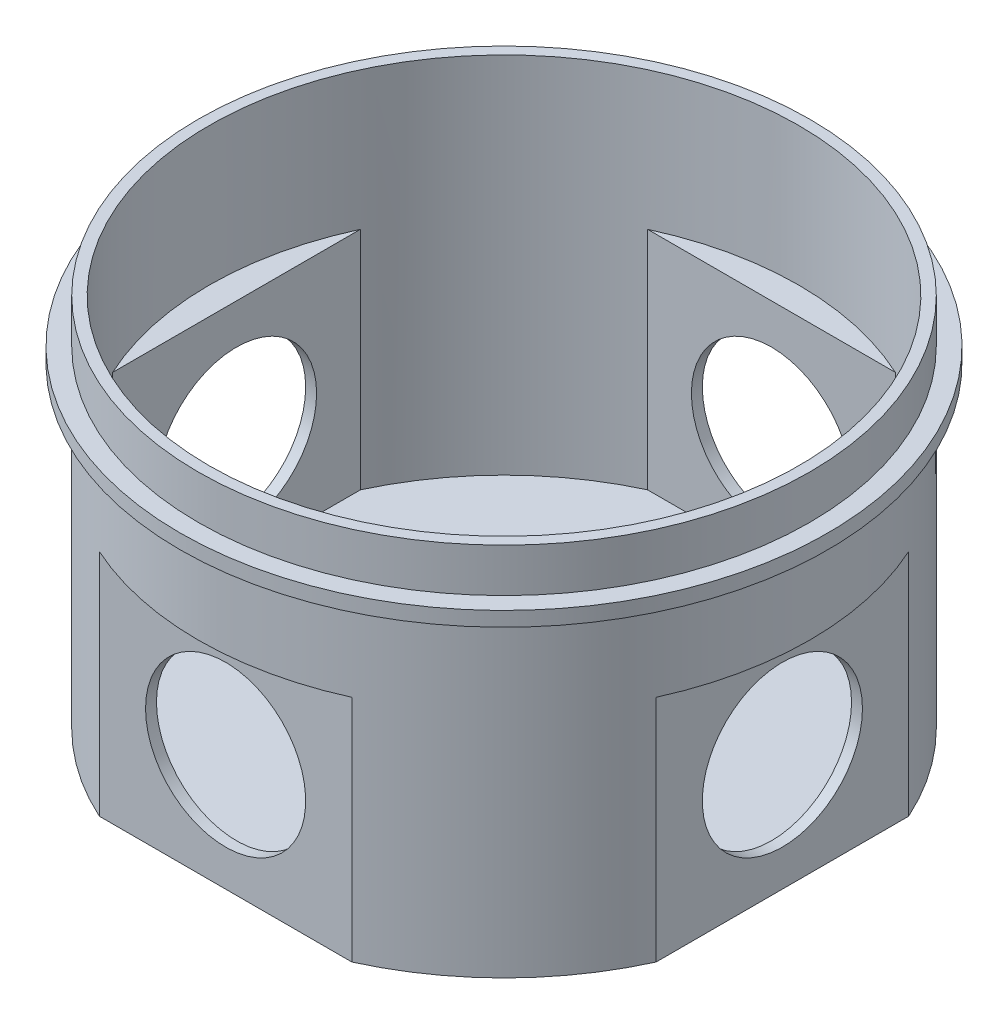
ISO-10303-21;
HEADER;
FILE_DESCRIPTION(('STEP AP214'),'2;1');
FILE_NAME('part.step','',(''),(''),'','','');
FILE_SCHEMA(('AUTOMOTIVE_DESIGN { 1 0 10303 214 1 1 1 1 }'));
ENDSEC;
DATA;
#1=APPLICATION_CONTEXT('core data for automotive mechanical design processes');
#2=APPLICATION_PROTOCOL_DEFINITION('international standard','automotive_design',2000,#1);
#3=PRODUCT_CONTEXT('',#1,'mechanical');
#4=PRODUCT('Part','Part','',(#3));
#5=PRODUCT_RELATED_PRODUCT_CATEGORY('part','',(#4));
#6=PRODUCT_DEFINITION_FORMATION('','',#4);
#7=PRODUCT_DEFINITION_CONTEXT('part definition',#1,'design');
#8=PRODUCT_DEFINITION('design','',#6,#7);
#9=PRODUCT_DEFINITION_SHAPE('','',#8);
#10=(LENGTH_UNIT() NAMED_UNIT(*) SI_UNIT(.MILLI.,.METRE.));
#11=(NAMED_UNIT(*) PLANE_ANGLE_UNIT() SI_UNIT($,.RADIAN.));
#12=(NAMED_UNIT(*) SI_UNIT($,.STERADIAN.) SOLID_ANGLE_UNIT());
#13=UNCERTAINTY_MEASURE_WITH_UNIT(LENGTH_MEASURE(1.E-05),#10,'distance_accuracy_value','');
#14=(GEOMETRIC_REPRESENTATION_CONTEXT(3) GLOBAL_UNCERTAINTY_ASSIGNED_CONTEXT((#13)) GLOBAL_UNIT_ASSIGNED_CONTEXT((#10,
#11,#12)) REPRESENTATION_CONTEXT('',''));
#15=CARTESIAN_POINT('',(0.,0.,0.));
#16=DIRECTION('',(0.,0.,1.));
#17=DIRECTION('',(1.,0.,0.));
#18=AXIS2_PLACEMENT_3D('',#15,#16,#17);
#19=CARTESIAN_POINT('',(0.,45.5,0.));
#20=DIRECTION('',(0.,1.,0.));
#21=DIRECTION('',(0.,0.,1.));
#22=AXIS2_PLACEMENT_3D('',#19,#20,#21);
#23=PLANE('',#22);
#24=CARTESIAN_POINT('',(0.,45.5,0.));
#25=DIRECTION('',(0.,1.,0.));
#26=DIRECTION('',(0.,0.,1.));
#27=AXIS2_PLACEMENT_3D('',#24,#25,#26);
#28=CIRCLE('',#27,44.5);
#29=CARTESIAN_POINT('',(0.,45.5,44.5));
#30=VERTEX_POINT('',#29);
#31=EDGE_CURVE('E338',#30,#30,#28,.T.);
#32=ORIENTED_EDGE('',*,*,#31,.T.);
#33=EDGE_LOOP('',(#32));
#34=FACE_BOUND('',#33,.T.);
#35=CARTESIAN_POINT('',(0.,45.5,0.));
#36=DIRECTION('',(0.,1.,0.));
#37=DIRECTION('',(0.,0.,1.));
#38=AXIS2_PLACEMENT_3D('',#35,#36,#37);
#39=CIRCLE('',#38,42.);
#40=CARTESIAN_POINT('',(0.,45.5,42.));
#41=VERTEX_POINT('',#40);
#42=EDGE_CURVE('E329',#41,#41,#39,.T.);
#43=ORIENTED_EDGE('',*,*,#42,.F.);
#44=EDGE_LOOP('',(#43));
#45=FACE_BOUND('',#44,.T.);
#46=ADVANCED_FACE('F39',(#34,#45),#23,.T.);
#47=CARTESIAN_POINT('',(0.,43.5,0.));
#48=DIRECTION('',(0.,1.,0.));
#49=DIRECTION('',(0.,0.,1.));
#50=AXIS2_PLACEMENT_3D('',#47,#48,#49);
#51=PLANE('',#50);
#52=CARTESIAN_POINT('',(0.,43.5,0.));
#53=DIRECTION('',(0.,1.,0.));
#54=DIRECTION('',(0.,0.,1.));
#55=AXIS2_PLACEMENT_3D('',#52,#53,#54);
#56=CIRCLE('',#55,42.);
#57=CARTESIAN_POINT('',(0.,43.5,42.));
#58=VERTEX_POINT('',#57);
#59=EDGE_CURVE('E188',#58,#58,#56,.T.);
#60=ORIENTED_EDGE('',*,*,#59,.T.);
#61=EDGE_LOOP('',(#60));
#62=FACE_BOUND('',#61,.T.);
#63=CARTESIAN_POINT('',(0.,43.5,0.));
#64=DIRECTION('',(0.,1.,0.));
#65=DIRECTION('',(0.,0.,1.));
#66=AXIS2_PLACEMENT_3D('',#63,#64,#65);
#67=CIRCLE('',#66,44.5);
#68=CARTESIAN_POINT('',(0.,43.5,44.5));
#69=VERTEX_POINT('',#68);
#70=EDGE_CURVE('E334',#69,#69,#67,.T.);
#71=ORIENTED_EDGE('',*,*,#70,.F.);
#72=EDGE_LOOP('',(#71));
#73=FACE_BOUND('',#72,.T.);
#74=ADVANCED_FACE('F388',(#62,#73),#51,.F.);
#75=CARTESIAN_POINT('',(0.,45.5,0.));
#76=DIRECTION('',(0.,-1.,0.));
#77=DIRECTION('',(0.,0.,-1.));
#78=AXIS2_PLACEMENT_3D('',#75,#76,#77);
#79=CYLINDRICAL_SURFACE('',#78,44.5);
#80=ORIENTED_EDGE('',*,*,#31,.F.);
#81=EDGE_LOOP('',(#80));
#82=FACE_BOUND('',#81,.T.);
#83=ORIENTED_EDGE('',*,*,#70,.T.);
#84=EDGE_LOOP('',(#83));
#85=FACE_BOUND('',#84,.T.);
#86=ADVANCED_FACE('F394',(#82,#85),#79,.T.);
#87=CARTESIAN_POINT('',(0.,31.5,0.));
#88=DIRECTION('',(0.,1.,0.));
#89=DIRECTION('',(0.,0.,1.));
#90=AXIS2_PLACEMENT_3D('',#87,#88,#89);
#91=PLANE('',#90);
#92=CARTESIAN_POINT('',(0.,31.5,0.));
#93=DIRECTION('',(0.,1.,0.));
#94=DIRECTION('',(0.,0.,1.));
#95=AXIS2_PLACEMENT_3D('',#92,#93,#94);
#96=CIRCLE('',#95,42.);
#97=CARTESIAN_POINT('',(-38.25,31.5,-17.3475502593306));
#98=VERTEX_POINT('',#97);
#99=CARTESIAN_POINT('',(-38.25,31.5,17.3475502593306));
#100=VERTEX_POINT('',#99);
#101=EDGE_CURVE('E187',#98,#100,#96,.T.);
#102=ORIENTED_EDGE('',*,*,#101,.F.);
#103=DIRECTION('',(0.,0.,1.));
#104=VECTOR('',#103,1.);
#105=CARTESIAN_POINT('',(-38.25,31.5,-17.3475502593306));
#106=LINE('',#105,#104);
#107=EDGE_CURVE('E246',#98,#100,#106,.T.);
#108=ORIENTED_EDGE('',*,*,#107,.T.);
#109=EDGE_LOOP('',(#102,#108));
#110=FACE_BOUND('',#109,.T.);
#111=ADVANCED_FACE('F402',(#110),#91,.F.);
#112=CARTESIAN_POINT('',(-38.25,1.5,0.));
#113=DIRECTION('',(1.,0.,0.));
#114=DIRECTION('',(0.,0.,-1.));
#115=AXIS2_PLACEMENT_3D('',#112,#113,#114);
#116=PLANE('',#115);
#117=CARTESIAN_POINT('',(-38.25,16.,0.));
#118=DIRECTION('',(1.,0.,0.));
#119=DIRECTION('',(0.,0.,-1.));
#120=AXIS2_PLACEMENT_3D('',#117,#118,#119);
#121=CIRCLE('',#120,11.);
#122=CARTESIAN_POINT('',(-38.25,16.,-11.));
#123=VERTEX_POINT('',#122);
#124=EDGE_CURVE('E309',#123,#123,#121,.T.);
#125=ORIENTED_EDGE('',*,*,#124,.T.);
#126=EDGE_LOOP('',(#125));
#127=FACE_BOUND('',#126,.T.);
#128=DIRECTION('',(0.,0.,1.));
#129=VECTOR('',#128,1.);
#130=CARTESIAN_POINT('',(-38.25,0.,0.));
#131=LINE('',#130,#129);
#132=CARTESIAN_POINT('',(-38.25,0.,-17.3475502593306));
#133=VERTEX_POINT('',#132);
#134=CARTESIAN_POINT('',(-38.25,0.,17.3475502593306));
#135=VERTEX_POINT('',#134);
#136=EDGE_CURVE('E269',#133,#135,#131,.T.);
#137=ORIENTED_EDGE('',*,*,#136,.T.);
#138=DIRECTION('',(0.,-1.,0.));
#139=VECTOR('',#138,1.);
#140=CARTESIAN_POINT('',(-38.25,1.5,17.3475502593306));
#141=LINE('',#140,#139);
#142=EDGE_CURVE('E276',#100,#135,#141,.T.);
#143=ORIENTED_EDGE('',*,*,#142,.F.);
#144=ORIENTED_EDGE('',*,*,#107,.F.);
#145=DIRECTION('',(0.,-1.,0.));
#146=VECTOR('',#145,1.);
#147=CARTESIAN_POINT('',(-38.25,1.5,-17.3475502593306));
#148=LINE('',#147,#146);
#149=EDGE_CURVE('E280',#98,#133,#148,.T.);
#150=ORIENTED_EDGE('',*,*,#149,.T.);
#151=EDGE_LOOP('',(#137,#143,#144,#150));
#152=FACE_BOUND('',#151,.T.);
#153=ADVANCED_FACE('F462',(#127,#152),#116,.F.);
#154=CARTESIAN_POINT('',(17.3475502593306,31.5,-38.25));
#155=VERTEX_POINT('',#154);
#156=CARTESIAN_POINT('',(-17.3475502593306,31.5,-38.25));
#157=VERTEX_POINT('',#156);
#158=EDGE_CURVE('E497',#155,#157,#96,.T.);
#159=ORIENTED_EDGE('',*,*,#158,.F.);
#160=DIRECTION('',(-1.,0.,0.));
#161=VECTOR('',#160,1.);
#162=CARTESIAN_POINT('',(17.3475502593306,31.5,-38.25));
#163=LINE('',#162,#161);
#164=EDGE_CURVE('E242',#155,#157,#163,.T.);
#165=ORIENTED_EDGE('',*,*,#164,.T.);
#166=EDGE_LOOP('',(#159,#165));
#167=FACE_BOUND('',#166,.T.);
#168=ADVANCED_FACE('F465',(#167),#91,.F.);
#169=CARTESIAN_POINT('',(0.,1.5,-38.25));
#170=DIRECTION('',(0.,0.,-1.));
#171=DIRECTION('',(-1.,0.,0.));
#172=AXIS2_PLACEMENT_3D('',#169,#170,#171);
#173=PLANE('',#172);
#174=CARTESIAN_POINT('',(-1.3354916121075E-13,16.,-38.25));
#175=DIRECTION('',(0.,0.,-1.));
#176=DIRECTION('',(-1.,0.,0.));
#177=AXIS2_PLACEMENT_3D('',#174,#175,#176);
#178=CIRCLE('',#177,11.);
#179=CARTESIAN_POINT('',(-11.0000000000001,16.,-38.25));
#180=VERTEX_POINT('',#179);
#181=EDGE_CURVE('E610',#180,#180,#178,.T.);
#182=ORIENTED_EDGE('',*,*,#181,.F.);
#183=EDGE_LOOP('',(#182));
#184=FACE_BOUND('',#183,.T.);
#185=DIRECTION('',(1.,0.,0.));
#186=VECTOR('',#185,1.);
#187=CARTESIAN_POINT('',(0.,0.,-38.25));
#188=LINE('',#187,#186);
#189=CARTESIAN_POINT('',(-17.3475502593306,0.,-38.25));
#190=VERTEX_POINT('',#189);
#191=CARTESIAN_POINT('',(17.3475502593306,0.,-38.25));
#192=VERTEX_POINT('',#191);
#193=EDGE_CURVE('E264',#190,#192,#188,.T.);
#194=ORIENTED_EDGE('',*,*,#193,.F.);
#195=DIRECTION('',(0.,-1.,0.));
#196=VECTOR('',#195,1.);
#197=CARTESIAN_POINT('',(-17.3475502593306,1.5,-38.25));
#198=LINE('',#197,#196);
#199=EDGE_CURVE('E284',#157,#190,#198,.T.);
#200=ORIENTED_EDGE('',*,*,#199,.F.);
#201=ORIENTED_EDGE('',*,*,#164,.F.);
#202=DIRECTION('',(0.,-1.,0.));
#203=VECTOR('',#202,1.);
#204=CARTESIAN_POINT('',(17.3475502593306,1.5,-38.25));
#205=LINE('',#204,#203);
#206=EDGE_CURVE('E287',#155,#192,#205,.T.);
#207=ORIENTED_EDGE('',*,*,#206,.T.);
#208=EDGE_LOOP('',(#194,#200,#201,#207));
#209=FACE_BOUND('',#208,.T.);
#210=ADVANCED_FACE('F467',(#184,#209),#173,.T.);
#211=CARTESIAN_POINT('',(38.25,31.5,17.3475502593306));
#212=VERTEX_POINT('',#211);
#213=CARTESIAN_POINT('',(38.25,31.5,-17.3475502593306));
#214=VERTEX_POINT('',#213);
#215=EDGE_CURVE('E189',#212,#214,#96,.T.);
#216=ORIENTED_EDGE('',*,*,#215,.F.);
#217=DIRECTION('',(0.,0.,-1.));
#218=VECTOR('',#217,1.);
#219=CARTESIAN_POINT('',(38.25,31.5,17.3475502593306));
#220=LINE('',#219,#218);
#221=EDGE_CURVE('E238',#212,#214,#220,.T.);
#222=ORIENTED_EDGE('',*,*,#221,.T.);
#223=EDGE_LOOP('',(#216,#222));
#224=FACE_BOUND('',#223,.T.);
#225=ADVANCED_FACE('F410',(#224),#91,.F.);
#226=CARTESIAN_POINT('',(38.25,1.5,0.));
#227=DIRECTION('',(1.,0.,0.));
#228=DIRECTION('',(0.,0.,-1.));
#229=AXIS2_PLACEMENT_3D('',#226,#227,#228);
#230=PLANE('',#229);
#231=CARTESIAN_POINT('',(38.25,16.,0.));
#232=DIRECTION('',(1.,0.,0.));
#233=DIRECTION('',(0.,0.,-1.));
#234=AXIS2_PLACEMENT_3D('',#231,#232,#233);
#235=CIRCLE('',#234,11.);
#236=CARTESIAN_POINT('',(38.25,16.,-11.));
#237=VERTEX_POINT('',#236);
#238=EDGE_CURVE('E303',#237,#237,#235,.T.);
#239=ORIENTED_EDGE('',*,*,#238,.F.);
#240=EDGE_LOOP('',(#239));
#241=FACE_BOUND('',#240,.T.);
#242=DIRECTION('',(0.,0.,1.));
#243=VECTOR('',#242,1.);
#244=CARTESIAN_POINT('',(38.25,0.,0.));
#245=LINE('',#244,#243);
#246=CARTESIAN_POINT('',(38.25,0.,-17.3475502593306));
#247=VERTEX_POINT('',#246);
#248=CARTESIAN_POINT('',(38.25,0.,17.3475502593306));
#249=VERTEX_POINT('',#248);
#250=EDGE_CURVE('E258',#247,#249,#245,.T.);
#251=ORIENTED_EDGE('',*,*,#250,.F.);
#252=DIRECTION('',(0.,-1.,0.));
#253=VECTOR('',#252,1.);
#254=CARTESIAN_POINT('',(38.25,1.5,-17.3475502593306));
#255=LINE('',#254,#253);
#256=EDGE_CURVE('E290',#214,#247,#255,.T.);
#257=ORIENTED_EDGE('',*,*,#256,.F.);
#258=ORIENTED_EDGE('',*,*,#221,.F.);
#259=DIRECTION('',(0.,-1.,0.));
#260=VECTOR('',#259,1.);
#261=CARTESIAN_POINT('',(38.25,1.5,17.3475502593306));
#262=LINE('',#261,#260);
#263=EDGE_CURVE('E293',#212,#249,#262,.T.);
#264=ORIENTED_EDGE('',*,*,#263,.T.);
#265=EDGE_LOOP('',(#251,#257,#258,#264));
#266=FACE_BOUND('',#265,.T.);
#267=ADVANCED_FACE('F408',(#241,#266),#230,.T.);
#268=CARTESIAN_POINT('',(-17.3475502593306,31.5,38.25));
#269=VERTEX_POINT('',#268);
#270=CARTESIAN_POINT('',(17.3475502593306,31.5,38.25));
#271=VERTEX_POINT('',#270);
#272=EDGE_CURVE('E184',#269,#271,#96,.T.);
#273=ORIENTED_EDGE('',*,*,#272,.F.);
#274=DIRECTION('',(1.,0.,0.));
#275=VECTOR('',#274,1.);
#276=CARTESIAN_POINT('',(-17.3475502593306,31.5,38.25));
#277=LINE('',#276,#275);
#278=EDGE_CURVE('E234',#269,#271,#277,.T.);
#279=ORIENTED_EDGE('',*,*,#278,.T.);
#280=EDGE_LOOP('',(#273,#279));
#281=FACE_BOUND('',#280,.T.);
#282=ADVANCED_FACE('F405',(#281),#91,.F.);
#283=CARTESIAN_POINT('',(0.,1.5,38.25));
#284=DIRECTION('',(0.,0.,-1.));
#285=DIRECTION('',(-1.,0.,0.));
#286=AXIS2_PLACEMENT_3D('',#283,#284,#285);
#287=PLANE('',#286);
#288=CARTESIAN_POINT('',(1.3354916121075E-13,16.,38.25));
#289=DIRECTION('',(0.,0.,-1.));
#290=DIRECTION('',(-1.,0.,0.));
#291=AXIS2_PLACEMENT_3D('',#288,#289,#290);
#292=CIRCLE('',#291,11.);
#293=CARTESIAN_POINT('',(-10.9999999999999,16.,38.25));
#294=VERTEX_POINT('',#293);
#295=EDGE_CURVE('E312',#294,#294,#292,.T.);
#296=ORIENTED_EDGE('',*,*,#295,.T.);
#297=EDGE_LOOP('',(#296));
#298=FACE_BOUND('',#297,.T.);
#299=DIRECTION('',(1.,0.,0.));
#300=VECTOR('',#299,1.);
#301=CARTESIAN_POINT('',(0.,0.,38.25));
#302=LINE('',#301,#300);
#303=CARTESIAN_POINT('',(-17.3475502593306,0.,38.25));
#304=VERTEX_POINT('',#303);
#305=CARTESIAN_POINT('',(17.3475502593306,0.,38.25));
#306=VERTEX_POINT('',#305);
#307=EDGE_CURVE('E250',#304,#306,#302,.T.);
#308=ORIENTED_EDGE('',*,*,#307,.T.);
#309=DIRECTION('',(0.,-1.,0.));
#310=VECTOR('',#309,1.);
#311=CARTESIAN_POINT('',(17.3475502593306,1.5,38.25));
#312=LINE('',#311,#310);
#313=EDGE_CURVE('E296',#271,#306,#312,.T.);
#314=ORIENTED_EDGE('',*,*,#313,.F.);
#315=ORIENTED_EDGE('',*,*,#278,.F.);
#316=DIRECTION('',(0.,-1.,0.));
#317=VECTOR('',#316,1.);
#318=CARTESIAN_POINT('',(-17.3475502593306,1.5,38.25));
#319=LINE('',#318,#317);
#320=EDGE_CURVE('E272',#269,#304,#319,.T.);
#321=ORIENTED_EDGE('',*,*,#320,.T.);
#322=EDGE_LOOP('',(#308,#314,#315,#321));
#323=FACE_BOUND('',#322,.T.);
#324=ADVANCED_FACE('F41',(#298,#323),#287,.F.);
#325=CARTESIAN_POINT('',(0.,0.,0.));
#326=DIRECTION('',(0.,1.,0.));
#327=DIRECTION('',(0.,0.,1.));
#328=AXIS2_PLACEMENT_3D('',#325,#326,#327);
#329=PLANE('',#328);
#330=ORIENTED_EDGE('',*,*,#307,.F.);
#331=CARTESIAN_POINT('',(0.,0.,0.));
#332=DIRECTION('',(0.,1.,0.));
#333=DIRECTION('',(0.,0.,1.));
#334=AXIS2_PLACEMENT_3D('',#331,#332,#333);
#335=CIRCLE('',#334,42.);
#336=EDGE_CURVE('E259',#135,#304,#335,.T.);
#337=ORIENTED_EDGE('',*,*,#336,.F.);
#338=ORIENTED_EDGE('',*,*,#136,.F.);
#339=EDGE_CURVE('E268',#190,#133,#335,.T.);
#340=ORIENTED_EDGE('',*,*,#339,.F.);
#341=ORIENTED_EDGE('',*,*,#193,.T.);
#342=EDGE_CURVE('E260',#247,#192,#335,.T.);
#343=ORIENTED_EDGE('',*,*,#342,.F.);
#344=ORIENTED_EDGE('',*,*,#250,.T.);
#345=EDGE_CURVE('E254',#306,#249,#335,.T.);
#346=ORIENTED_EDGE('',*,*,#345,.F.);
#347=EDGE_LOOP('',(#330,#337,#338,#340,#341,#343,#344,#346));
#348=FACE_BOUND('',#347,.T.);
#349=ADVANCED_FACE('F447',(#348),#329,.F.);
#350=CARTESIAN_POINT('',(0.,1.5,0.));
#351=DIRECTION('',(0.,-1.,0.));
#352=DIRECTION('',(0.,0.,-1.));
#353=AXIS2_PLACEMENT_3D('',#350,#351,#352);
#354=CYLINDRICAL_SURFACE('',#353,42.);
#355=ORIENTED_EDGE('',*,*,#336,.T.);
#356=ORIENTED_EDGE('',*,*,#320,.F.);
#357=ORIENTED_EDGE('',*,*,#272,.T.);
#358=ORIENTED_EDGE('',*,*,#313,.T.);
#359=ORIENTED_EDGE('',*,*,#345,.T.);
#360=ORIENTED_EDGE('',*,*,#263,.F.);
#361=ORIENTED_EDGE('',*,*,#215,.T.);
#362=ORIENTED_EDGE('',*,*,#256,.T.);
#363=ORIENTED_EDGE('',*,*,#342,.T.);
#364=ORIENTED_EDGE('',*,*,#206,.F.);
#365=ORIENTED_EDGE('',*,*,#158,.T.);
#366=ORIENTED_EDGE('',*,*,#199,.T.);
#367=ORIENTED_EDGE('',*,*,#339,.T.);
#368=ORIENTED_EDGE('',*,*,#149,.F.);
#369=ORIENTED_EDGE('',*,*,#101,.T.);
#370=ORIENTED_EDGE('',*,*,#142,.T.);
#371=EDGE_LOOP('',(#355,#356,#357,#358,#359,#360,#361,#362,#363,#364,#365,#366,#367,#368,#369,#370));
#372=FACE_BOUND('',#371,.T.);
#373=ORIENTED_EDGE('',*,*,#59,.F.);
#374=EDGE_LOOP('',(#373));
#375=FACE_BOUND('',#374,.T.);
#376=ADVANCED_FACE('F440',(#372,#375),#354,.T.);
#377=CARTESIAN_POINT('',(0.,51.5,0.));
#378=DIRECTION('',(0.,1.,0.));
#379=DIRECTION('',(0.,0.,1.));
#380=AXIS2_PLACEMENT_3D('',#377,#378,#379);
#381=PLANE('',#380);
#382=CARTESIAN_POINT('',(0.,51.5,0.));
#383=DIRECTION('',(0.,1.,0.));
#384=DIRECTION('',(0.,0.,1.));
#385=AXIS2_PLACEMENT_3D('',#382,#383,#384);
#386=CIRCLE('',#385,42.);
#387=CARTESIAN_POINT('',(0.,51.5,42.));
#388=VERTEX_POINT('',#387);
#389=EDGE_CURVE('E330',#388,#388,#386,.T.);
#390=ORIENTED_EDGE('',*,*,#389,.T.);
#391=EDGE_LOOP('',(#390));
#392=FACE_BOUND('',#391,.T.);
#393=CARTESIAN_POINT('',(0.,51.5,0.));
#394=DIRECTION('',(0.,1.,0.));
#395=DIRECTION('',(0.,0.,1.));
#396=AXIS2_PLACEMENT_3D('',#393,#394,#395);
#397=CIRCLE('',#396,40.5);
#398=CARTESIAN_POINT('',(0.,51.5,40.5));
#399=VERTEX_POINT('',#398);
#400=EDGE_CURVE('E325',#399,#399,#397,.T.);
#401=ORIENTED_EDGE('',*,*,#400,.F.);
#402=EDGE_LOOP('',(#401));
#403=FACE_BOUND('',#402,.T.);
#404=ADVANCED_FACE('F438',(#392,#403),#381,.T.);
#405=CARTESIAN_POINT('',(0.,51.5,0.));
#406=DIRECTION('',(0.,-1.,0.));
#407=DIRECTION('',(0.,0.,-1.));
#408=AXIS2_PLACEMENT_3D('',#405,#406,#407);
#409=CYLINDRICAL_SURFACE('',#408,42.);
#410=ORIENTED_EDGE('',*,*,#389,.F.);
#411=EDGE_LOOP('',(#410));
#412=FACE_BOUND('',#411,.T.);
#413=ORIENTED_EDGE('',*,*,#42,.T.);
#414=EDGE_LOOP('',(#413));
#415=FACE_BOUND('',#414,.T.);
#416=ADVANCED_FACE('F383',(#412,#415),#409,.T.);
#417=CARTESIAN_POINT('',(0.,32.5,0.));
#418=DIRECTION('',(0.,1.,0.));
#419=DIRECTION('',(0.,0.,1.));
#420=AXIS2_PLACEMENT_3D('',#417,#418,#419);
#421=PLANE('',#420);
#422=DIRECTION('',(-1.,0.,0.));
#423=VECTOR('',#422,1.);
#424=CARTESIAN_POINT('',(0.,32.5,36.75));
#425=LINE('',#424,#423);
#426=CARTESIAN_POINT('',(17.0202085768653,32.5,36.75));
#427=VERTEX_POINT('',#426);
#428=CARTESIAN_POINT('',(-17.0202085768653,32.5,36.75));
#429=VERTEX_POINT('',#428);
#430=EDGE_CURVE('E348',#427,#429,#425,.T.);
#431=ORIENTED_EDGE('',*,*,#430,.T.);
#432=CARTESIAN_POINT('',(0.,32.5,0.));
#433=DIRECTION('',(0.,1.,0.));
#434=DIRECTION('',(0.,0.,1.));
#435=AXIS2_PLACEMENT_3D('',#432,#433,#434);
#436=CIRCLE('',#435,40.5);
#437=EDGE_CURVE('E51',#429,#427,#436,.T.);
#438=ORIENTED_EDGE('',*,*,#437,.T.);
#439=EDGE_LOOP('',(#431,#438));
#440=FACE_BOUND('',#439,.T.);
#441=ADVANCED_FACE('F369',(#440),#421,.T.);
#442=CARTESIAN_POINT('',(-17.0202085768653,31.5,36.75));
#443=DIRECTION('',(0.,0.,-1.));
#444=DIRECTION('',(-1.,0.,0.));
#445=AXIS2_PLACEMENT_3D('',#442,#443,#444);
#446=PLANE('',#445);
#447=CARTESIAN_POINT('',(1.28311939202485E-13,16.,36.75));
#448=DIRECTION('',(0.,0.,-1.));
#449=DIRECTION('',(-1.,0.,0.));
#450=AXIS2_PLACEMENT_3D('',#447,#448,#449);
#451=CIRCLE('',#450,11.);
#452=CARTESIAN_POINT('',(-10.9999999999999,16.,36.75));
#453=VERTEX_POINT('',#452);
#454=EDGE_CURVE('E318',#453,#453,#451,.T.);
#455=ORIENTED_EDGE('',*,*,#454,.F.);
#456=EDGE_LOOP('',(#455));
#457=FACE_BOUND('',#456,.T.);
#458=DIRECTION('',(1.,0.,0.));
#459=VECTOR('',#458,1.);
#460=CARTESIAN_POINT('',(-17.0202085768653,1.5,36.75));
#461=LINE('',#460,#459);
#462=CARTESIAN_POINT('',(-17.0202085768653,1.5,36.75));
#463=VERTEX_POINT('',#462);
#464=CARTESIAN_POINT('',(17.0202085768653,1.5,36.75));
#465=VERTEX_POINT('',#464);
#466=EDGE_CURVE('E62',#463,#465,#461,.T.);
#467=ORIENTED_EDGE('',*,*,#466,.F.);
#468=DIRECTION('',(0.,-1.,0.));
#469=VECTOR('',#468,1.);
#470=CARTESIAN_POINT('',(-17.0202085768653,31.5,36.75));
#471=LINE('',#470,#469);
#472=EDGE_CURVE('E230',#429,#463,#471,.T.);
#473=ORIENTED_EDGE('',*,*,#472,.F.);
#474=ORIENTED_EDGE('',*,*,#430,.F.);
#475=DIRECTION('',(0.,-1.,0.));
#476=VECTOR('',#475,1.);
#477=CARTESIAN_POINT('',(17.0202085768653,31.5,36.75));
#478=LINE('',#477,#476);
#479=EDGE_CURVE('E170',#427,#465,#478,.T.);
#480=ORIENTED_EDGE('',*,*,#479,.T.);
#481=EDGE_LOOP('',(#467,#473,#474,#480));
#482=FACE_BOUND('',#481,.T.);
#483=ADVANCED_FACE('F373',(#457,#482),#446,.T.);
#484=DIRECTION('',(0.,0.,1.));
#485=VECTOR('',#484,1.);
#486=CARTESIAN_POINT('',(36.75,32.5,0.));
#487=LINE('',#486,#485);
#488=CARTESIAN_POINT('',(36.75,32.5,-17.0202085768653));
#489=VERTEX_POINT('',#488);
#490=CARTESIAN_POINT('',(36.75,32.5,17.0202085768653));
#491=VERTEX_POINT('',#490);
#492=EDGE_CURVE('E167',#489,#491,#487,.T.);
#493=ORIENTED_EDGE('',*,*,#492,.T.);
#494=EDGE_CURVE('E11',#491,#489,#436,.T.);
#495=ORIENTED_EDGE('',*,*,#494,.T.);
#496=EDGE_LOOP('',(#493,#495));
#497=FACE_BOUND('',#496,.T.);
#498=ADVANCED_FACE('F172',(#497),#421,.T.);
#499=CARTESIAN_POINT('',(36.75,31.5,17.0202085768653));
#500=DIRECTION('',(-1.,0.,0.));
#501=DIRECTION('',(0.,0.,1.));
#502=AXIS2_PLACEMENT_3D('',#499,#500,#501);
#503=PLANE('',#502);
#504=CARTESIAN_POINT('',(36.75,16.,0.));
#505=DIRECTION('',(-1.,0.,0.));
#506=DIRECTION('',(0.,0.,1.));
#507=AXIS2_PLACEMENT_3D('',#504,#505,#506);
#508=CIRCLE('',#507,11.);
#509=CARTESIAN_POINT('',(36.75,16.,11.));
#510=VERTEX_POINT('',#509);
#511=EDGE_CURVE('E302',#510,#510,#508,.T.);
#512=ORIENTED_EDGE('',*,*,#511,.F.);
#513=EDGE_LOOP('',(#512));
#514=FACE_BOUND('',#513,.T.);
#515=DIRECTION('',(0.,0.,-1.));
#516=VECTOR('',#515,1.);
#517=CARTESIAN_POINT('',(36.75,1.5,17.0202085768653));
#518=LINE('',#517,#516);
#519=CARTESIAN_POINT('',(36.75,1.5,17.0202085768653));
#520=VERTEX_POINT('',#519);
#521=CARTESIAN_POINT('',(36.75,1.5,-17.0202085768653));
#522=VERTEX_POINT('',#521);
#523=EDGE_CURVE('E168',#520,#522,#518,.T.);
#524=ORIENTED_EDGE('',*,*,#523,.F.);
#525=DIRECTION('',(0.,-1.,0.));
#526=VECTOR('',#525,1.);
#527=CARTESIAN_POINT('',(36.75,31.5,17.0202085768653));
#528=LINE('',#527,#526);
#529=EDGE_CURVE('E157',#491,#520,#528,.T.);
#530=ORIENTED_EDGE('',*,*,#529,.F.);
#531=ORIENTED_EDGE('',*,*,#492,.F.);
#532=DIRECTION('',(0.,-1.,0.));
#533=VECTOR('',#532,1.);
#534=CARTESIAN_POINT('',(36.75,31.5,-17.0202085768653));
#535=LINE('',#534,#533);
#536=EDGE_CURVE('E161',#489,#522,#535,.T.);
#537=ORIENTED_EDGE('',*,*,#536,.T.);
#538=EDGE_LOOP('',(#524,#530,#531,#537));
#539=FACE_BOUND('',#538,.T.);
#540=ADVANCED_FACE('F166',(#514,#539),#503,.T.);
#541=DIRECTION('',(1.,0.,0.));
#542=VECTOR('',#541,1.);
#543=CARTESIAN_POINT('',(0.,32.5,-36.75));
#544=LINE('',#543,#542);
#545=CARTESIAN_POINT('',(-17.0202085768653,32.5,-36.75));
#546=VERTEX_POINT('',#545);
#547=CARTESIAN_POINT('',(17.0202085768653,32.5,-36.75));
#548=VERTEX_POINT('',#547);
#549=EDGE_CURVE('E174',#546,#548,#544,.T.);
#550=ORIENTED_EDGE('',*,*,#549,.T.);
#551=EDGE_CURVE('E49',#548,#546,#436,.T.);
#552=ORIENTED_EDGE('',*,*,#551,.T.);
#553=EDGE_LOOP('',(#550,#552));
#554=FACE_BOUND('',#553,.T.);
#555=ADVANCED_FACE('F382',(#554),#421,.T.);
#556=CARTESIAN_POINT('',(17.0202085768653,31.5,-36.75));
#557=DIRECTION('',(0.,0.,1.));
#558=DIRECTION('',(1.,0.,0.));
#559=AXIS2_PLACEMENT_3D('',#556,#557,#558);
#560=PLANE('',#559);
#561=CARTESIAN_POINT('',(-1.28311939202485E-13,16.,-36.75));
#562=DIRECTION('',(0.,0.,1.));
#563=DIRECTION('',(1.,0.,0.));
#564=AXIS2_PLACEMENT_3D('',#561,#562,#563);
#565=CIRCLE('',#564,11.);
#566=CARTESIAN_POINT('',(10.9999999999999,16.,-36.75));
#567=VERTEX_POINT('',#566);
#568=EDGE_CURVE('E43',#567,#567,#565,.T.);
#569=ORIENTED_EDGE('',*,*,#568,.F.);
#570=EDGE_LOOP('',(#569));
#571=FACE_BOUND('',#570,.T.);
#572=DIRECTION('',(-1.,0.,0.));
#573=VECTOR('',#572,1.);
#574=CARTESIAN_POINT('',(17.0202085768653,1.5,-36.75));
#575=LINE('',#574,#573);
#576=CARTESIAN_POINT('',(17.0202085768653,1.5,-36.75));
#577=VERTEX_POINT('',#576);
#578=CARTESIAN_POINT('',(-17.0202085768653,1.5,-36.75));
#579=VERTEX_POINT('',#578);
#580=EDGE_CURVE('E201',#577,#579,#575,.T.);
#581=ORIENTED_EDGE('',*,*,#580,.F.);
#582=DIRECTION('',(0.,-1.,0.));
#583=VECTOR('',#582,1.);
#584=CARTESIAN_POINT('',(17.0202085768653,31.5,-36.75));
#585=LINE('',#584,#583);
#586=EDGE_CURVE('E222',#548,#577,#585,.T.);
#587=ORIENTED_EDGE('',*,*,#586,.F.);
#588=ORIENTED_EDGE('',*,*,#549,.F.);
#589=DIRECTION('',(0.,-1.,0.));
#590=VECTOR('',#589,1.);
#591=CARTESIAN_POINT('',(-17.0202085768653,31.5,-36.75));
#592=LINE('',#591,#590);
#593=EDGE_CURVE('E218',#546,#579,#592,.T.);
#594=ORIENTED_EDGE('',*,*,#593,.T.);
#595=EDGE_LOOP('',(#581,#587,#588,#594));
#596=FACE_BOUND('',#595,.T.);
#597=ADVANCED_FACE('F415',(#571,#596),#560,.T.);
#598=DIRECTION('',(0.,0.,-1.));
#599=VECTOR('',#598,1.);
#600=CARTESIAN_POINT('',(-36.75,32.5,0.));
#601=LINE('',#600,#599);
#602=CARTESIAN_POINT('',(-36.75,32.5,17.0202085768653));
#603=VERTEX_POINT('',#602);
#604=CARTESIAN_POINT('',(-36.75,32.5,-17.0202085768653));
#605=VERTEX_POINT('',#604);
#606=EDGE_CURVE('E180',#603,#605,#601,.T.);
#607=ORIENTED_EDGE('',*,*,#606,.T.);
#608=EDGE_CURVE('E356',#605,#603,#436,.T.);
#609=ORIENTED_EDGE('',*,*,#608,.T.);
#610=EDGE_LOOP('',(#607,#609));
#611=FACE_BOUND('',#610,.T.);
#612=ADVANCED_FACE('F355',(#611),#421,.T.);
#613=CARTESIAN_POINT('',(-36.75,31.5,-17.0202085768653));
#614=DIRECTION('',(1.,0.,0.));
#615=DIRECTION('',(0.,0.,-1.));
#616=AXIS2_PLACEMENT_3D('',#613,#614,#615);
#617=PLANE('',#616);
#618=CARTESIAN_POINT('',(-36.75,16.,0.));
#619=DIRECTION('',(1.,0.,0.));
#620=DIRECTION('',(0.,0.,-1.));
#621=AXIS2_PLACEMENT_3D('',#618,#619,#620);
#622=CIRCLE('',#621,11.);
#623=CARTESIAN_POINT('',(-36.75,16.,-11.));
#624=VERTEX_POINT('',#623);
#625=EDGE_CURVE('E299',#624,#624,#622,.T.);
#626=ORIENTED_EDGE('',*,*,#625,.F.);
#627=EDGE_LOOP('',(#626));
#628=FACE_BOUND('',#627,.T.);
#629=DIRECTION('',(0.,0.,1.));
#630=VECTOR('',#629,1.);
#631=CARTESIAN_POINT('',(-36.75,1.5,-17.0202085768653));
#632=LINE('',#631,#630);
#633=CARTESIAN_POINT('',(-36.75,1.5,-17.0202085768653));
#634=VERTEX_POINT('',#633);
#635=CARTESIAN_POINT('',(-36.75,1.5,17.0202085768653));
#636=VERTEX_POINT('',#635);
#637=EDGE_CURVE('E207',#634,#636,#632,.T.);
#638=ORIENTED_EDGE('',*,*,#637,.F.);
#639=DIRECTION('',(0.,-1.,0.));
#640=VECTOR('',#639,1.);
#641=CARTESIAN_POINT('',(-36.75,31.5,-17.0202085768653));
#642=LINE('',#641,#640);
#643=EDGE_CURVE('E214',#605,#634,#642,.T.);
#644=ORIENTED_EDGE('',*,*,#643,.F.);
#645=ORIENTED_EDGE('',*,*,#606,.F.);
#646=DIRECTION('',(0.,-1.,0.));
#647=VECTOR('',#646,1.);
#648=CARTESIAN_POINT('',(-36.75,31.5,17.0202085768653));
#649=LINE('',#648,#647);
#650=EDGE_CURVE('E210',#603,#636,#649,.T.);
#651=ORIENTED_EDGE('',*,*,#650,.T.);
#652=EDGE_LOOP('',(#638,#644,#645,#651));
#653=FACE_BOUND('',#652,.T.);
#654=ADVANCED_FACE('F361',(#628,#653),#617,.T.);
#655=CARTESIAN_POINT('',(0.,1.5,0.));
#656=DIRECTION('',(0.,1.,0.));
#657=DIRECTION('',(0.,0.,1.));
#658=AXIS2_PLACEMENT_3D('',#655,#656,#657);
#659=PLANE('',#658);
#660=CARTESIAN_POINT('',(0.,1.5,0.));
#661=DIRECTION('',(0.,1.,0.));
#662=DIRECTION('',(0.,0.,1.));
#663=AXIS2_PLACEMENT_3D('',#660,#661,#662);
#664=CIRCLE('',#663,40.5);
#665=EDGE_CURVE('E58',#636,#463,#664,.T.);
#666=ORIENTED_EDGE('',*,*,#665,.T.);
#667=ORIENTED_EDGE('',*,*,#466,.T.);
#668=CARTESIAN_POINT('',(0.,1.5,0.));
#669=DIRECTION('',(0.,1.,0.));
#670=DIRECTION('',(0.,0.,1.));
#671=AXIS2_PLACEMENT_3D('',#668,#669,#670);
#672=CIRCLE('',#671,40.5);
#673=EDGE_CURVE('E193',#465,#520,#672,.T.);
#674=ORIENTED_EDGE('',*,*,#673,.T.);
#675=ORIENTED_EDGE('',*,*,#523,.T.);
#676=CARTESIAN_POINT('',(0.,1.5,0.));
#677=DIRECTION('',(0.,1.,0.));
#678=DIRECTION('',(0.,0.,1.));
#679=AXIS2_PLACEMENT_3D('',#676,#677,#678);
#680=CIRCLE('',#679,40.5);
#681=EDGE_CURVE('E198',#522,#577,#680,.T.);
#682=ORIENTED_EDGE('',*,*,#681,.T.);
#683=ORIENTED_EDGE('',*,*,#580,.T.);
#684=CARTESIAN_POINT('',(0.,1.5,0.));
#685=DIRECTION('',(0.,1.,0.));
#686=DIRECTION('',(0.,0.,1.));
#687=AXIS2_PLACEMENT_3D('',#684,#685,#686);
#688=CIRCLE('',#687,40.5);
#689=EDGE_CURVE('E204',#579,#634,#688,.T.);
#690=ORIENTED_EDGE('',*,*,#689,.T.);
#691=ORIENTED_EDGE('',*,*,#637,.T.);
#692=EDGE_LOOP('',(#666,#667,#674,#675,#682,#683,#690,#691));
#693=FACE_BOUND('',#692,.T.);
#694=ADVANCED_FACE('F413',(#693),#659,.T.);
#695=CARTESIAN_POINT('',(0.,31.5,0.));
#696=DIRECTION('',(0.,-1.,0.));
#697=DIRECTION('',(0.,0.,-1.));
#698=AXIS2_PLACEMENT_3D('',#695,#696,#697);
#699=CYLINDRICAL_SURFACE('',#698,40.5);
#700=ORIENTED_EDGE('',*,*,#665,.F.);
#701=ORIENTED_EDGE('',*,*,#650,.F.);
#702=ORIENTED_EDGE('',*,*,#608,.F.);
#703=ORIENTED_EDGE('',*,*,#643,.T.);
#704=ORIENTED_EDGE('',*,*,#689,.F.);
#705=ORIENTED_EDGE('',*,*,#593,.F.);
#706=ORIENTED_EDGE('',*,*,#551,.F.);
#707=ORIENTED_EDGE('',*,*,#586,.T.);
#708=ORIENTED_EDGE('',*,*,#681,.F.);
#709=ORIENTED_EDGE('',*,*,#536,.F.);
#710=ORIENTED_EDGE('',*,*,#494,.F.);
#711=ORIENTED_EDGE('',*,*,#529,.T.);
#712=ORIENTED_EDGE('',*,*,#673,.F.);
#713=ORIENTED_EDGE('',*,*,#479,.F.);
#714=ORIENTED_EDGE('',*,*,#437,.F.);
#715=ORIENTED_EDGE('',*,*,#472,.T.);
#716=EDGE_LOOP('',(#700,#701,#702,#703,#704,#705,#706,#707,#708,#709,#710,#711,#712,#713,#714,#715));
#717=FACE_BOUND('',#716,.T.);
#718=ORIENTED_EDGE('',*,*,#400,.T.);
#719=EDGE_LOOP('',(#718));
#720=FACE_BOUND('',#719,.T.);
#721=ADVANCED_FACE('F154',(#717,#720),#699,.F.);
#722=CARTESIAN_POINT('',(-44.5,16.,0.));
#723=DIRECTION('',(1.,0.,0.));
#724=DIRECTION('',(0.,0.,-1.));
#725=AXIS2_PLACEMENT_3D('',#722,#723,#724);
#726=CYLINDRICAL_SURFACE('',#725,11.);
#727=ORIENTED_EDGE('',*,*,#625,.T.);
#728=EDGE_LOOP('',(#727));
#729=FACE_BOUND('',#728,.T.);
#730=ORIENTED_EDGE('',*,*,#124,.F.);
#731=EDGE_LOOP('',(#730));
#732=FACE_BOUND('',#731,.T.);
#733=ADVANCED_FACE('F429',(#729,#732),#726,.F.);
#734=ORIENTED_EDGE('',*,*,#511,.T.);
#735=EDGE_LOOP('',(#734));
#736=FACE_BOUND('',#735,.T.);
#737=ORIENTED_EDGE('',*,*,#238,.T.);
#738=EDGE_LOOP('',(#737));
#739=FACE_BOUND('',#738,.T.);
#740=ADVANCED_FACE('F426',(#736,#739),#726,.F.);
#741=CARTESIAN_POINT('',(1.5537091957852E-13,16.,44.5000000000002));
#742=DIRECTION('',(0.,0.,-1.));
#743=DIRECTION('',(-1.,0.,0.));
#744=AXIS2_PLACEMENT_3D('',#741,#742,#743);
#745=CYLINDRICAL_SURFACE('',#744,11.);
#746=ORIENTED_EDGE('',*,*,#568,.T.);
#747=EDGE_LOOP('',(#746));
#748=FACE_BOUND('',#747,.T.);
#749=ORIENTED_EDGE('',*,*,#181,.T.);
#750=EDGE_LOOP('',(#749));
#751=FACE_BOUND('',#750,.T.);
#752=ADVANCED_FACE('F428',(#748,#751),#745,.F.);
#753=ORIENTED_EDGE('',*,*,#454,.T.);
#754=EDGE_LOOP('',(#753));
#755=FACE_BOUND('',#754,.T.);
#756=ORIENTED_EDGE('',*,*,#295,.F.);
#757=EDGE_LOOP('',(#756));
#758=FACE_BOUND('',#757,.T.);
#759=ADVANCED_FACE('F435',(#755,#758),#745,.F.);
#760=CLOSED_SHELL('',(#46,#74,#86,#111,#153,#168,#210,#225,#267,#282,#324,#349,#376,#404,#416,
#441,#483,#498,#540,#555,#597,#612,#654,#694,#721,#733,#740,#752,#759));
#761=MANIFOLD_SOLID_BREP('B2',#760);
#762=ADVANCED_BREP_SHAPE_REPRESENTATION('',(#18,#761),#14);
#763=SHAPE_DEFINITION_REPRESENTATION(#9,#762);
ENDSEC;
END-ISO-10303-21;
